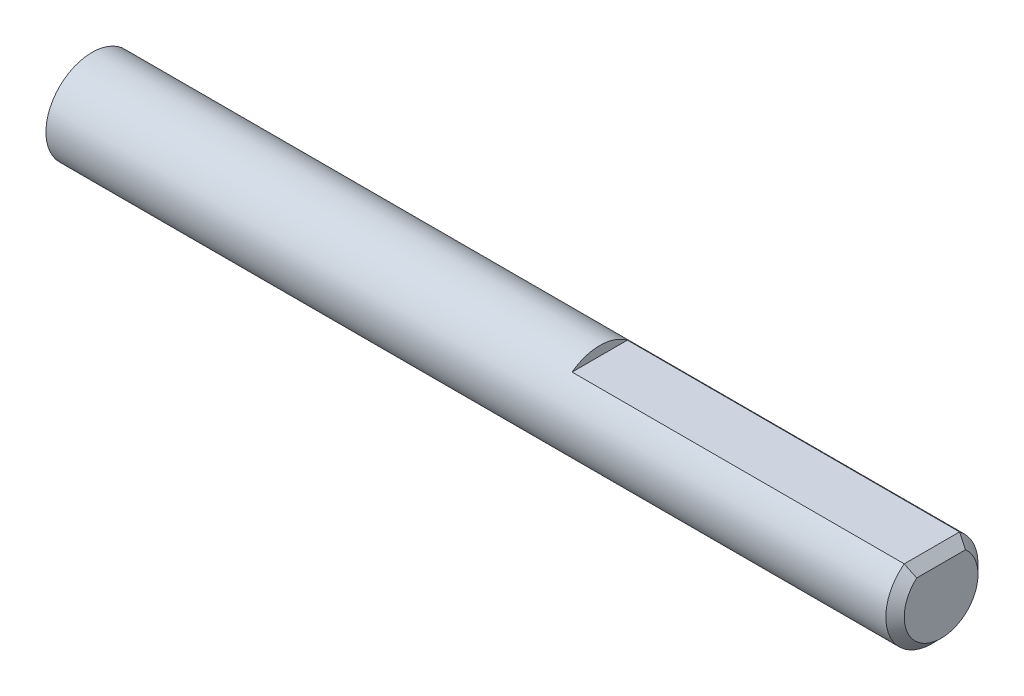
ISO-10303-21;
HEADER;
FILE_DESCRIPTION(('STEP AP214'),'2;1');
FILE_NAME('part.step','',(''),(''),'','','');
FILE_SCHEMA(('AUTOMOTIVE_DESIGN { 1 0 10303 214 1 1 1 1 }'));
ENDSEC;
DATA;
#1=APPLICATION_CONTEXT('core data for automotive mechanical design processes');
#2=APPLICATION_PROTOCOL_DEFINITION('international standard','automotive_design',2000,#1);
#3=PRODUCT_CONTEXT('',#1,'mechanical');
#4=PRODUCT('Part','Part','',(#3));
#5=PRODUCT_RELATED_PRODUCT_CATEGORY('part','',(#4));
#6=PRODUCT_DEFINITION_FORMATION('','',#4);
#7=PRODUCT_DEFINITION_CONTEXT('part definition',#1,'design');
#8=PRODUCT_DEFINITION('design','',#6,#7);
#9=PRODUCT_DEFINITION_SHAPE('','',#8);
#10=(LENGTH_UNIT() NAMED_UNIT(*) SI_UNIT(.MILLI.,.METRE.));
#11=(NAMED_UNIT(*) PLANE_ANGLE_UNIT() SI_UNIT($,.RADIAN.));
#12=(NAMED_UNIT(*) SI_UNIT($,.STERADIAN.) SOLID_ANGLE_UNIT());
#13=UNCERTAINTY_MEASURE_WITH_UNIT(LENGTH_MEASURE(1.E-05),#10,'distance_accuracy_value','');
#14=(GEOMETRIC_REPRESENTATION_CONTEXT(3) GLOBAL_UNCERTAINTY_ASSIGNED_CONTEXT((#13)) GLOBAL_UNIT_ASSIGNED_CONTEXT((#10,
#11,#12)) REPRESENTATION_CONTEXT('',''));
#15=CARTESIAN_POINT('',(0.,0.,0.));
#16=DIRECTION('',(0.,0.,1.));
#17=DIRECTION('',(1.,0.,0.));
#18=AXIS2_PLACEMENT_3D('',#15,#16,#17);
#19=CARTESIAN_POINT('',(46.04,0.,0.));
#20=DIRECTION('',(-1.,0.,0.));
#21=DIRECTION('',(0.,0.,1.));
#22=AXIS2_PLACEMENT_3D('',#19,#20,#21);
#23=CYLINDRICAL_SURFACE('',#22,2.5);
#24=CARTESIAN_POINT('',(0.,0.,0.));
#25=DIRECTION('',(1.,0.,0.));
#26=DIRECTION('',(0.,0.,-1.));
#27=AXIS2_PLACEMENT_3D('',#24,#25,#26);
#28=CIRCLE('',#27,2.5);
#29=CARTESIAN_POINT('',(0.,0.,-2.5));
#30=VERTEX_POINT('',#29);
#31=EDGE_CURVE('E103',#30,#30,#28,.T.);
#32=ORIENTED_EDGE('',*,*,#31,.T.);
#33=EDGE_LOOP('',(#32));
#34=FACE_BOUND('',#33,.T.);
#35=DIRECTION('',(-1.,0.,0.));
#36=VECTOR('',#35,1.);
#37=CARTESIAN_POINT('',(46.04,2.,-1.5));
#38=LINE('',#37,#36);
#39=CARTESIAN_POINT('',(45.54,2.,-1.5));
#40=VERTEX_POINT('',#39);
#41=CARTESIAN_POINT('',(27.53,2.,-1.5));
#42=VERTEX_POINT('',#41);
#43=EDGE_CURVE('E85',#40,#42,#38,.T.);
#44=ORIENTED_EDGE('',*,*,#43,.F.);
#45=CARTESIAN_POINT('',(45.54,0.,0.));
#46=DIRECTION('',(1.,0.,0.));
#47=DIRECTION('',(0.,0.,-1.));
#48=AXIS2_PLACEMENT_3D('',#45,#46,#47);
#49=CIRCLE('',#48,2.5);
#50=CARTESIAN_POINT('',(45.54,2.,1.5));
#51=VERTEX_POINT('',#50);
#52=EDGE_CURVE('E11',#40,#51,#49,.F.);
#53=ORIENTED_EDGE('',*,*,#52,.T.);
#54=DIRECTION('',(1.,0.,0.));
#55=VECTOR('',#54,1.);
#56=CARTESIAN_POINT('',(46.04,2.,1.5));
#57=LINE('',#56,#55);
#58=CARTESIAN_POINT('',(27.53,2.,1.5));
#59=VERTEX_POINT('',#58);
#60=EDGE_CURVE('E100',#59,#51,#57,.T.);
#61=ORIENTED_EDGE('',*,*,#60,.F.);
#62=CARTESIAN_POINT('',(27.53,0.,0.));
#63=DIRECTION('',(-1.,0.,0.));
#64=DIRECTION('',(0.,0.,1.));
#65=AXIS2_PLACEMENT_3D('',#62,#63,#64);
#66=CIRCLE('',#65,2.5);
#67=EDGE_CURVE('E98',#59,#42,#66,.T.);
#68=ORIENTED_EDGE('',*,*,#67,.T.);
#69=EDGE_LOOP('',(#44,#53,#61,#68));
#70=FACE_BOUND('',#69,.T.);
#71=ADVANCED_FACE('F41',(#34,#70),#23,.T.);
#72=CARTESIAN_POINT('',(46.04,0.,0.));
#73=DIRECTION('',(1.,0.,0.));
#74=DIRECTION('',(0.,0.,-1.));
#75=AXIS2_PLACEMENT_3D('',#72,#73,#74);
#76=PLANE('',#75);
#77=CARTESIAN_POINT('',(46.04,0.,0.));
#78=DIRECTION('',(1.,0.,0.));
#79=DIRECTION('',(0.,0.,-1.));
#80=AXIS2_PLACEMENT_3D('',#77,#78,#79);
#81=CIRCLE('',#80,1.99999999999999);
#82=CARTESIAN_POINT('',(46.04,1.49999999999999,1.32287565553229));
#83=VERTEX_POINT('',#82);
#84=CARTESIAN_POINT('',(46.04,1.49999999999999,-1.32287565553229));
#85=VERTEX_POINT('',#84);
#86=EDGE_CURVE('E64',#83,#85,#81,.T.);
#87=ORIENTED_EDGE('',*,*,#86,.T.);
#88=DIRECTION('',(0.,0.,1.));
#89=VECTOR('',#88,1.);
#90=CARTESIAN_POINT('',(46.04,1.49999999999999,0.));
#91=LINE('',#90,#89);
#92=EDGE_CURVE('E57',#85,#83,#91,.T.);
#93=ORIENTED_EDGE('',*,*,#92,.T.);
#94=EDGE_LOOP('',(#87,#93));
#95=FACE_BOUND('',#94,.T.);
#96=ADVANCED_FACE('F132',(#95),#76,.T.);
#97=CARTESIAN_POINT('',(0.,0.,0.));
#98=DIRECTION('',(1.,0.,0.));
#99=DIRECTION('',(0.,0.,-1.));
#100=AXIS2_PLACEMENT_3D('',#97,#98,#99);
#101=PLANE('',#100);
#102=ORIENTED_EDGE('',*,*,#31,.F.);
#103=EDGE_LOOP('',(#102));
#104=FACE_BOUND('',#103,.T.);
#105=ADVANCED_FACE('F134',(#104),#101,.F.);
#106=CARTESIAN_POINT('',(27.53,2.,1.5));
#107=DIRECTION('',(-1.,0.,0.));
#108=DIRECTION('',(0.,0.,1.));
#109=AXIS2_PLACEMENT_3D('',#106,#107,#108);
#110=PLANE('',#109);
#111=DIRECTION('',(0.,0.,1.));
#112=VECTOR('',#111,1.);
#113=CARTESIAN_POINT('',(27.53,2.,1.5));
#114=LINE('',#113,#112);
#115=EDGE_CURVE('E89',#42,#59,#114,.T.);
#116=ORIENTED_EDGE('',*,*,#115,.F.);
#117=ORIENTED_EDGE('',*,*,#67,.F.);
#118=EDGE_LOOP('',(#116,#117));
#119=FACE_BOUND('',#118,.T.);
#120=ADVANCED_FACE('F97',(#119),#110,.F.);
#121=CARTESIAN_POINT('',(0.,2.,0.));
#122=DIRECTION('',(0.,1.,0.));
#123=DIRECTION('',(0.,0.,1.));
#124=AXIS2_PLACEMENT_3D('',#121,#122,#123);
#125=PLANE('',#124);
#126=ORIENTED_EDGE('',*,*,#60,.T.);
#127=DIRECTION('',(0.,0.,-1.));
#128=VECTOR('',#127,1.);
#129=CARTESIAN_POINT('',(45.54,2.,0.));
#130=LINE('',#129,#128);
#131=EDGE_CURVE('E91',#51,#40,#130,.T.);
#132=ORIENTED_EDGE('',*,*,#131,.T.);
#133=ORIENTED_EDGE('',*,*,#43,.T.);
#134=ORIENTED_EDGE('',*,*,#115,.T.);
#135=EDGE_LOOP('',(#126,#132,#133,#134));
#136=FACE_BOUND('',#135,.T.);
#137=ADVANCED_FACE('F88',(#136),#125,.T.);
#138=CARTESIAN_POINT('',(46.04,0.,0.));
#139=DIRECTION('',(-1.,0.,0.));
#140=DIRECTION('',(0.,0.,1.));
#141=AXIS2_PLACEMENT_3D('',#138,#139,#140);
#142=CONICAL_SURFACE('',#141,1.99999999999999,0.785398163397446);
#143=CARTESIAN_POINT('',(45.54,2.,-1.5));
#144=CARTESIAN_POINT('',(45.5818104810861,1.95818951891394,-1.48606240845706));
#145=CARTESIAN_POINT('',(45.6235906920568,1.91640930794319,-1.47194219050032));
#146=CARTESIAN_POINT('',(45.7070803781444,1.83291962185563,-1.44330357435469));
#147=CARTESIAN_POINT('',(45.7487898570011,1.79121014299888,-1.42878519796258));
#148=CARTESIAN_POINT('',(45.8321330602124,1.70786693978759,-1.39931560745198));
#149=CARTESIAN_POINT('',(45.8737667834554,1.66623321654463,-1.38436438703584));
#150=CARTESIAN_POINT('',(45.9569498376851,1.58305016231494,-1.35398671696421));
#151=CARTESIAN_POINT('',(45.9984991639331,1.54150083606693,-1.33856024136969));
#152=CARTESIAN_POINT('',(46.04,1.49999999999999,-1.32287565553229));
#153=B_SPLINE_CURVE_WITH_KNOTS('',3,(#143,#144,#145,#146,#147,#148,#149,#150,#151,#152),
.UNSPECIFIED.,.F.,.F.,(4,2,2,2,4),(0.,0.18224823098936,0.364486504817096,0.546727431451298,
0.728978322325588),.UNSPECIFIED.);
#154=EDGE_CURVE('E115',#85,#40,#153,.F.);
#155=ORIENTED_EDGE('',*,*,#154,.F.);
#156=ORIENTED_EDGE('',*,*,#86,.F.);
#157=CARTESIAN_POINT('',(46.04,1.49999999999999,1.32287565553229));
#158=CARTESIAN_POINT('',(45.9984991639331,1.54150083606693,1.33856024136969));
#159=CARTESIAN_POINT('',(45.9569498376851,1.58305016231494,1.35398671696421));
#160=CARTESIAN_POINT('',(45.8737667834554,1.66623321654463,1.38436438703584));
#161=CARTESIAN_POINT('',(45.8321330602124,1.70786693978759,1.39931560745198));
#162=CARTESIAN_POINT('',(45.7487898570011,1.79121014299889,1.42878519796258));
#163=CARTESIAN_POINT('',(45.7070803781444,1.83291962185564,1.44330357435469));
#164=CARTESIAN_POINT('',(45.6235906920568,1.91640930794319,1.47194219050032));
#165=CARTESIAN_POINT('',(45.581810481086,1.95818951891394,1.48606240845706));
#166=CARTESIAN_POINT('',(45.54,2.,1.5));
#167=B_SPLINE_CURVE_WITH_KNOTS('',3,(#157,#158,#159,#160,#161,#162,#163,#164,#165,#166),
.UNSPECIFIED.,.F.,.F.,(4,2,2,2,4),(0.,0.182250890874289,0.364491817508491,0.546730091336237,
0.728978322325587),.UNSPECIFIED.);
#168=EDGE_CURVE('E47',#51,#83,#167,.F.);
#169=ORIENTED_EDGE('',*,*,#168,.F.);
#170=ORIENTED_EDGE('',*,*,#52,.F.);
#171=EDGE_LOOP('',(#155,#156,#169,#170));
#172=FACE_BOUND('',#171,.T.);
#173=ADVANCED_FACE('F122',(#172),#142,.T.);
#174=CARTESIAN_POINT('',(45.54,2.,0.));
#175=DIRECTION('',(-0.707106781186546,-0.707106781186549,0.));
#176=DIRECTION('',(0.,0.,-1.));
#177=AXIS2_PLACEMENT_3D('',#174,#175,#176);
#178=PLANE('',#177);
#179=ORIENTED_EDGE('',*,*,#168,.T.);
#180=ORIENTED_EDGE('',*,*,#92,.F.);
#181=ORIENTED_EDGE('',*,*,#154,.T.);
#182=ORIENTED_EDGE('',*,*,#131,.F.);
#183=EDGE_LOOP('',(#179,#180,#181,#182));
#184=FACE_BOUND('',#183,.T.);
#185=ADVANCED_FACE('F44',(#184),#178,.F.);
#186=CLOSED_SHELL('',(#71,#96,#105,#120,#137,#173,#185));
#187=MANIFOLD_SOLID_BREP('B2',#186);
#188=ADVANCED_BREP_SHAPE_REPRESENTATION('',(#18,#187),#14);
#189=SHAPE_DEFINITION_REPRESENTATION(#9,#188);
ENDSEC;
END-ISO-10303-21;
